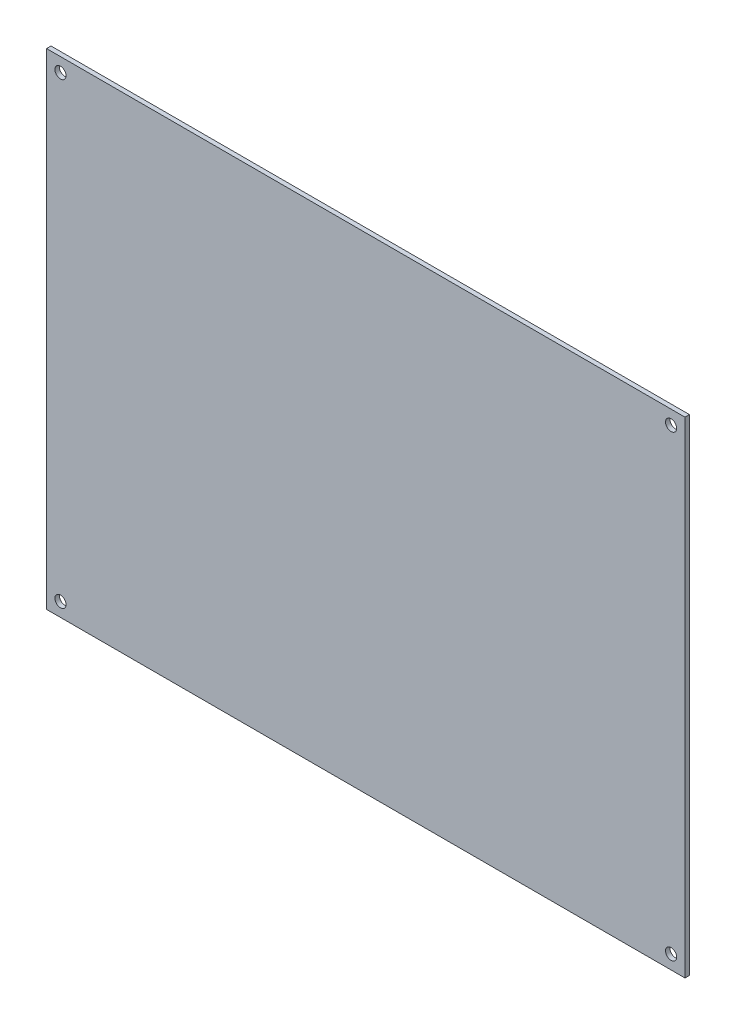
ISO-10303-21;
HEADER;
FILE_DESCRIPTION(('STEP AP214'),'2;1');
FILE_NAME('part.step','',(''),(''),'','','');
FILE_SCHEMA(('AUTOMOTIVE_DESIGN { 1 0 10303 214 1 1 1 1 }'));
ENDSEC;
DATA;
#1=APPLICATION_CONTEXT('core data for automotive mechanical design processes');
#2=APPLICATION_PROTOCOL_DEFINITION('international standard','automotive_design',2000,#1);
#3=PRODUCT_CONTEXT('',#1,'mechanical');
#4=PRODUCT('Part','Part','',(#3));
#5=PRODUCT_RELATED_PRODUCT_CATEGORY('part','',(#4));
#6=PRODUCT_DEFINITION_FORMATION('','',#4);
#7=PRODUCT_DEFINITION_CONTEXT('part definition',#1,'design');
#8=PRODUCT_DEFINITION('design','',#6,#7);
#9=PRODUCT_DEFINITION_SHAPE('','',#8);
#10=(LENGTH_UNIT() NAMED_UNIT(*) SI_UNIT(.MILLI.,.METRE.));
#11=(NAMED_UNIT(*) PLANE_ANGLE_UNIT() SI_UNIT($,.RADIAN.));
#12=(NAMED_UNIT(*) SI_UNIT($,.STERADIAN.) SOLID_ANGLE_UNIT());
#13=UNCERTAINTY_MEASURE_WITH_UNIT(LENGTH_MEASURE(1.E-05),#10,'distance_accuracy_value','');
#14=(GEOMETRIC_REPRESENTATION_CONTEXT(3) GLOBAL_UNCERTAINTY_ASSIGNED_CONTEXT((#13)) GLOBAL_UNIT_ASSIGNED_CONTEXT((#10,
#11,#12)) REPRESENTATION_CONTEXT('',''));
#15=CARTESIAN_POINT('',(0.,0.,0.));
#16=DIRECTION('',(0.,0.,1.));
#17=DIRECTION('',(1.,0.,0.));
#18=AXIS2_PLACEMENT_3D('',#15,#16,#17);
#19=CARTESIAN_POINT('',(0.,0.,1.6));
#20=DIRECTION('',(0.,0.,-1.));
#21=DIRECTION('',(-1.,0.,0.));
#22=AXIS2_PLACEMENT_3D('',#19,#20,#21);
#23=PLANE('',#22);
#24=DIRECTION('',(0.,1.,0.));
#25=VECTOR('',#24,1.);
#26=CARTESIAN_POINT('',(115.,-87.5,1.6));
#27=LINE('',#26,#25);
#28=CARTESIAN_POINT('',(115.,-87.5,1.6));
#29=VERTEX_POINT('',#28);
#30=CARTESIAN_POINT('',(115.,87.5,1.6));
#31=VERTEX_POINT('',#30);
#32=EDGE_CURVE('E85',#29,#31,#27,.T.);
#33=ORIENTED_EDGE('',*,*,#32,.T.);
#34=DIRECTION('',(-1.,0.,0.));
#35=VECTOR('',#34,1.);
#36=CARTESIAN_POINT('',(-115.,87.5,1.6));
#37=LINE('',#36,#35);
#38=CARTESIAN_POINT('',(-115.,87.5,1.6));
#39=VERTEX_POINT('',#38);
#40=EDGE_CURVE('E80',#31,#39,#37,.T.);
#41=ORIENTED_EDGE('',*,*,#40,.T.);
#42=DIRECTION('',(0.,-1.,0.));
#43=VECTOR('',#42,1.);
#44=CARTESIAN_POINT('',(-115.,-87.5,1.6));
#45=LINE('',#44,#43);
#46=CARTESIAN_POINT('',(-115.,-87.5,1.6));
#47=VERTEX_POINT('',#46);
#48=EDGE_CURVE('E83',#39,#47,#45,.T.);
#49=ORIENTED_EDGE('',*,*,#48,.T.);
#50=DIRECTION('',(1.,0.,0.));
#51=VECTOR('',#50,1.);
#52=CARTESIAN_POINT('',(-115.,-87.5,1.6));
#53=LINE('',#52,#51);
#54=EDGE_CURVE('E50',#47,#29,#53,.T.);
#55=ORIENTED_EDGE('',*,*,#54,.T.);
#56=EDGE_LOOP('',(#33,#41,#49,#55));
#57=FACE_BOUND('',#56,.T.);
#58=CARTESIAN_POINT('',(110.,82.5,1.6));
#59=DIRECTION('',(0.,0.,1.));
#60=DIRECTION('',(1.,0.,0.));
#61=AXIS2_PLACEMENT_3D('',#58,#59,#60);
#62=CIRCLE('',#61,2.);
#63=CARTESIAN_POINT('',(112.,82.5,1.6));
#64=VERTEX_POINT('',#63);
#65=EDGE_CURVE('E100',#64,#64,#62,.T.);
#66=ORIENTED_EDGE('',*,*,#65,.F.);
#67=EDGE_LOOP('',(#66));
#68=FACE_BOUND('',#67,.T.);
#69=CARTESIAN_POINT('',(110.,-82.5,1.6));
#70=DIRECTION('',(0.,0.,1.));
#71=DIRECTION('',(-1.,0.,0.));
#72=AXIS2_PLACEMENT_3D('',#69,#70,#71);
#73=CIRCLE('',#72,2.);
#74=CARTESIAN_POINT('',(108.,-82.5,1.6));
#75=VERTEX_POINT('',#74);
#76=EDGE_CURVE('E115',#75,#75,#73,.T.);
#77=ORIENTED_EDGE('',*,*,#76,.F.);
#78=EDGE_LOOP('',(#77));
#79=FACE_BOUND('',#78,.T.);
#80=CARTESIAN_POINT('',(-110.,-82.5,1.6));
#81=DIRECTION('',(0.,0.,1.));
#82=DIRECTION('',(1.,0.,0.));
#83=AXIS2_PLACEMENT_3D('',#80,#81,#82);
#84=CIRCLE('',#83,2.);
#85=CARTESIAN_POINT('',(-108.,-82.5,1.6));
#86=VERTEX_POINT('',#85);
#87=EDGE_CURVE('E121',#86,#86,#84,.T.);
#88=ORIENTED_EDGE('',*,*,#87,.F.);
#89=EDGE_LOOP('',(#88));
#90=FACE_BOUND('',#89,.T.);
#91=CARTESIAN_POINT('',(-110.,82.5,1.6));
#92=DIRECTION('',(0.,0.,1.));
#93=DIRECTION('',(-1.,0.,0.));
#94=AXIS2_PLACEMENT_3D('',#91,#92,#93);
#95=CIRCLE('',#94,2.);
#96=CARTESIAN_POINT('',(-112.,82.5,1.6));
#97=VERTEX_POINT('',#96);
#98=EDGE_CURVE('E127',#97,#97,#95,.T.);
#99=ORIENTED_EDGE('',*,*,#98,.F.);
#100=EDGE_LOOP('',(#99));
#101=FACE_BOUND('',#100,.T.);
#102=ADVANCED_FACE('F33',(#57,#68,#79,#90,#101),#23,.F.);
#103=CARTESIAN_POINT('',(0.,0.,0.));
#104=DIRECTION('',(0.,0.,-1.));
#105=DIRECTION('',(-1.,0.,0.));
#106=AXIS2_PLACEMENT_3D('',#103,#104,#105);
#107=PLANE('',#106);
#108=CARTESIAN_POINT('',(-110.,-82.5,0.));
#109=DIRECTION('',(0.,0.,1.));
#110=DIRECTION('',(1.,0.,0.));
#111=AXIS2_PLACEMENT_3D('',#108,#109,#110);
#112=CIRCLE('',#111,2.);
#113=CARTESIAN_POINT('',(-108.,-82.5,0.));
#114=VERTEX_POINT('',#113);
#115=EDGE_CURVE('E124',#114,#114,#112,.T.);
#116=ORIENTED_EDGE('',*,*,#115,.T.);
#117=EDGE_LOOP('',(#116));
#118=FACE_BOUND('',#117,.T.);
#119=CARTESIAN_POINT('',(110.,82.5,0.));
#120=DIRECTION('',(0.,0.,1.));
#121=DIRECTION('',(1.,0.,0.));
#122=AXIS2_PLACEMENT_3D('',#119,#120,#121);
#123=CIRCLE('',#122,2.);
#124=CARTESIAN_POINT('',(112.,82.5,0.));
#125=VERTEX_POINT('',#124);
#126=EDGE_CURVE('E112',#125,#125,#123,.T.);
#127=ORIENTED_EDGE('',*,*,#126,.T.);
#128=EDGE_LOOP('',(#127));
#129=FACE_BOUND('',#128,.T.);
#130=DIRECTION('',(0.,1.,0.));
#131=VECTOR('',#130,1.);
#132=CARTESIAN_POINT('',(115.,-87.5,0.));
#133=LINE('',#132,#131);
#134=CARTESIAN_POINT('',(115.,-87.5,0.));
#135=VERTEX_POINT('',#134);
#136=CARTESIAN_POINT('',(115.,87.5,0.));
#137=VERTEX_POINT('',#136);
#138=EDGE_CURVE('E97',#135,#137,#133,.T.);
#139=ORIENTED_EDGE('',*,*,#138,.F.);
#140=DIRECTION('',(1.,0.,0.));
#141=VECTOR('',#140,1.);
#142=CARTESIAN_POINT('',(-115.,-87.5,0.));
#143=LINE('',#142,#141);
#144=CARTESIAN_POINT('',(-115.,-87.5,0.));
#145=VERTEX_POINT('',#144);
#146=EDGE_CURVE('E73',#145,#135,#143,.T.);
#147=ORIENTED_EDGE('',*,*,#146,.F.);
#148=DIRECTION('',(0.,-1.,0.));
#149=VECTOR('',#148,1.);
#150=CARTESIAN_POINT('',(-115.,-87.5,0.));
#151=LINE('',#150,#149);
#152=CARTESIAN_POINT('',(-115.,87.5,0.));
#153=VERTEX_POINT('',#152);
#154=EDGE_CURVE('E67',#153,#145,#151,.T.);
#155=ORIENTED_EDGE('',*,*,#154,.F.);
#156=DIRECTION('',(-1.,0.,0.));
#157=VECTOR('',#156,1.);
#158=CARTESIAN_POINT('',(-115.,87.5,0.));
#159=LINE('',#158,#157);
#160=EDGE_CURVE('E89',#137,#153,#159,.T.);
#161=ORIENTED_EDGE('',*,*,#160,.F.);
#162=EDGE_LOOP('',(#139,#147,#155,#161));
#163=FACE_BOUND('',#162,.T.);
#164=CARTESIAN_POINT('',(110.,-82.5,0.));
#165=DIRECTION('',(0.,0.,1.));
#166=DIRECTION('',(-1.,0.,0.));
#167=AXIS2_PLACEMENT_3D('',#164,#165,#166);
#168=CIRCLE('',#167,2.);
#169=CARTESIAN_POINT('',(108.,-82.5,0.));
#170=VERTEX_POINT('',#169);
#171=EDGE_CURVE('E118',#170,#170,#168,.T.);
#172=ORIENTED_EDGE('',*,*,#171,.T.);
#173=EDGE_LOOP('',(#172));
#174=FACE_BOUND('',#173,.T.);
#175=CARTESIAN_POINT('',(-110.,82.5,0.));
#176=DIRECTION('',(0.,0.,1.));
#177=DIRECTION('',(-1.,0.,0.));
#178=AXIS2_PLACEMENT_3D('',#175,#176,#177);
#179=CIRCLE('',#178,2.);
#180=CARTESIAN_POINT('',(-112.,82.5,0.));
#181=VERTEX_POINT('',#180);
#182=EDGE_CURVE('E130',#181,#181,#179,.T.);
#183=ORIENTED_EDGE('',*,*,#182,.T.);
#184=EDGE_LOOP('',(#183));
#185=FACE_BOUND('',#184,.T.);
#186=ADVANCED_FACE('F108',(#118,#129,#163,#174,#185),#107,.T.);
#187=CARTESIAN_POINT('',(115.,-87.5,1.6));
#188=DIRECTION('',(-1.,0.,0.));
#189=DIRECTION('',(0.,0.,1.));
#190=AXIS2_PLACEMENT_3D('',#187,#188,#189);
#191=PLANE('',#190);
#192=ORIENTED_EDGE('',*,*,#138,.T.);
#193=DIRECTION('',(0.,0.,-1.));
#194=VECTOR('',#193,1.);
#195=CARTESIAN_POINT('',(115.,87.5,1.6));
#196=LINE('',#195,#194);
#197=EDGE_CURVE('E11',#31,#137,#196,.T.);
#198=ORIENTED_EDGE('',*,*,#197,.F.);
#199=ORIENTED_EDGE('',*,*,#32,.F.);
#200=DIRECTION('',(0.,0.,-1.));
#201=VECTOR('',#200,1.);
#202=CARTESIAN_POINT('',(115.,-87.5,1.6));
#203=LINE('',#202,#201);
#204=EDGE_CURVE('E93',#29,#135,#203,.T.);
#205=ORIENTED_EDGE('',*,*,#204,.T.);
#206=EDGE_LOOP('',(#192,#198,#199,#205));
#207=FACE_BOUND('',#206,.T.);
#208=ADVANCED_FACE('F35',(#207),#191,.F.);
#209=CARTESIAN_POINT('',(-115.,87.5,1.6));
#210=DIRECTION('',(0.,-1.,0.));
#211=DIRECTION('',(0.,0.,-1.));
#212=AXIS2_PLACEMENT_3D('',#209,#210,#211);
#213=PLANE('',#212);
#214=ORIENTED_EDGE('',*,*,#160,.T.);
#215=DIRECTION('',(0.,0.,-1.));
#216=VECTOR('',#215,1.);
#217=CARTESIAN_POINT('',(-115.,87.5,1.6));
#218=LINE('',#217,#216);
#219=EDGE_CURVE('E42',#39,#153,#218,.T.);
#220=ORIENTED_EDGE('',*,*,#219,.F.);
#221=ORIENTED_EDGE('',*,*,#40,.F.);
#222=ORIENTED_EDGE('',*,*,#197,.T.);
#223=EDGE_LOOP('',(#214,#220,#221,#222));
#224=FACE_BOUND('',#223,.T.);
#225=ADVANCED_FACE('F88',(#224),#213,.F.);
#226=CARTESIAN_POINT('',(-115.,-87.5,1.6));
#227=DIRECTION('',(1.,0.,0.));
#228=DIRECTION('',(0.,0.,-1.));
#229=AXIS2_PLACEMENT_3D('',#226,#227,#228);
#230=PLANE('',#229);
#231=ORIENTED_EDGE('',*,*,#154,.T.);
#232=DIRECTION('',(0.,0.,-1.));
#233=VECTOR('',#232,1.);
#234=CARTESIAN_POINT('',(-115.,-87.5,1.6));
#235=LINE('',#234,#233);
#236=EDGE_CURVE('E90',#47,#145,#235,.T.);
#237=ORIENTED_EDGE('',*,*,#236,.F.);
#238=ORIENTED_EDGE('',*,*,#48,.F.);
#239=ORIENTED_EDGE('',*,*,#219,.T.);
#240=EDGE_LOOP('',(#231,#237,#238,#239));
#241=FACE_BOUND('',#240,.T.);
#242=ADVANCED_FACE('F91',(#241),#230,.F.);
#243=CARTESIAN_POINT('',(-115.,-87.5,1.6));
#244=DIRECTION('',(0.,1.,0.));
#245=DIRECTION('',(0.,0.,1.));
#246=AXIS2_PLACEMENT_3D('',#243,#244,#245);
#247=PLANE('',#246);
#248=ORIENTED_EDGE('',*,*,#146,.T.);
#249=ORIENTED_EDGE('',*,*,#204,.F.);
#250=ORIENTED_EDGE('',*,*,#54,.F.);
#251=ORIENTED_EDGE('',*,*,#236,.T.);
#252=EDGE_LOOP('',(#248,#249,#250,#251));
#253=FACE_BOUND('',#252,.T.);
#254=ADVANCED_FACE('F105',(#253),#247,.F.);
#255=CARTESIAN_POINT('',(110.,82.5,1.6));
#256=DIRECTION('',(0.,0.,-1.));
#257=DIRECTION('',(-1.,0.,0.));
#258=AXIS2_PLACEMENT_3D('',#255,#256,#257);
#259=CYLINDRICAL_SURFACE('',#258,2.);
#260=ORIENTED_EDGE('',*,*,#65,.T.);
#261=EDGE_LOOP('',(#260));
#262=FACE_BOUND('',#261,.T.);
#263=ORIENTED_EDGE('',*,*,#126,.F.);
#264=EDGE_LOOP('',(#263));
#265=FACE_BOUND('',#264,.T.);
#266=ADVANCED_FACE('F147',(#262,#265),#259,.F.);
#267=CARTESIAN_POINT('',(110.,-82.5,1.6));
#268=DIRECTION('',(0.,0.,-1.));
#269=DIRECTION('',(-1.,0.,0.));
#270=AXIS2_PLACEMENT_3D('',#267,#268,#269);
#271=CYLINDRICAL_SURFACE('',#270,2.);
#272=ORIENTED_EDGE('',*,*,#76,.T.);
#273=EDGE_LOOP('',(#272));
#274=FACE_BOUND('',#273,.T.);
#275=ORIENTED_EDGE('',*,*,#171,.F.);
#276=EDGE_LOOP('',(#275));
#277=FACE_BOUND('',#276,.T.);
#278=ADVANCED_FACE('F193',(#274,#277),#271,.F.);
#279=CARTESIAN_POINT('',(-110.,-82.5,1.6));
#280=DIRECTION('',(0.,0.,-1.));
#281=DIRECTION('',(-1.,0.,0.));
#282=AXIS2_PLACEMENT_3D('',#279,#280,#281);
#283=CYLINDRICAL_SURFACE('',#282,2.);
#284=ORIENTED_EDGE('',*,*,#87,.T.);
#285=EDGE_LOOP('',(#284));
#286=FACE_BOUND('',#285,.T.);
#287=ORIENTED_EDGE('',*,*,#115,.F.);
#288=EDGE_LOOP('',(#287));
#289=FACE_BOUND('',#288,.T.);
#290=ADVANCED_FACE('F201',(#286,#289),#283,.F.);
#291=CARTESIAN_POINT('',(-110.,82.5,1.6));
#292=DIRECTION('',(0.,0.,-1.));
#293=DIRECTION('',(-1.,0.,0.));
#294=AXIS2_PLACEMENT_3D('',#291,#292,#293);
#295=CYLINDRICAL_SURFACE('',#294,2.);
#296=ORIENTED_EDGE('',*,*,#98,.T.);
#297=EDGE_LOOP('',(#296));
#298=FACE_BOUND('',#297,.T.);
#299=ORIENTED_EDGE('',*,*,#182,.F.);
#300=EDGE_LOOP('',(#299));
#301=FACE_BOUND('',#300,.T.);
#302=ADVANCED_FACE('F136',(#298,#301),#295,.F.);
#303=CLOSED_SHELL('',(#102,#186,#208,#225,#242,#254,#266,#278,#290,#302));
#304=MANIFOLD_SOLID_BREP('B2',#303);
#305=ADVANCED_BREP_SHAPE_REPRESENTATION('',(#18,#304),#14);
#306=SHAPE_DEFINITION_REPRESENTATION(#9,#305);
ENDSEC;
END-ISO-10303-21;
